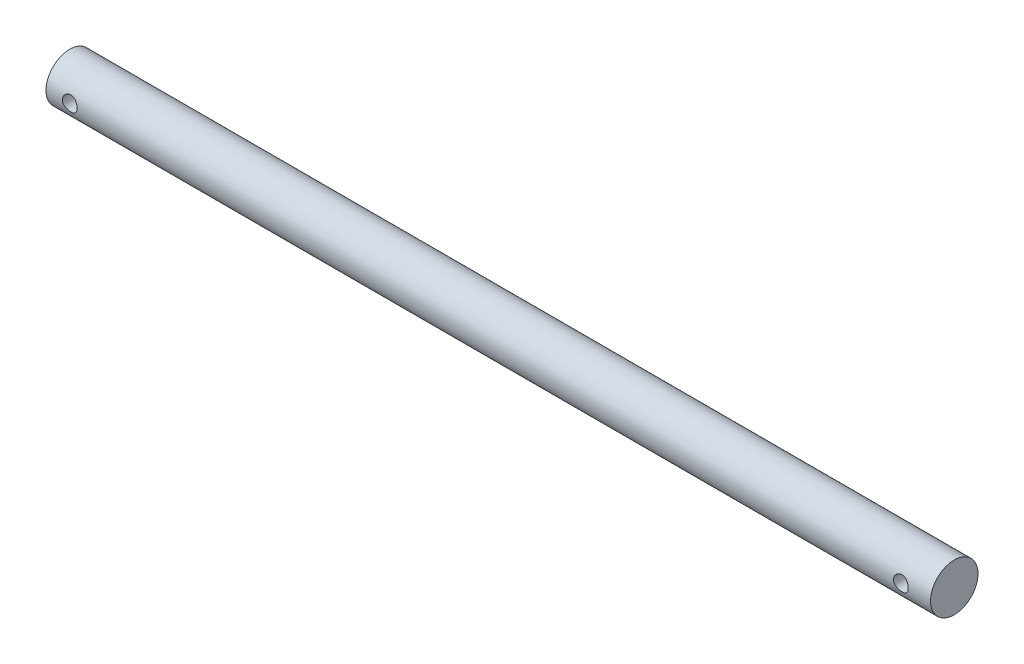
ISO-10303-21;
HEADER;
FILE_DESCRIPTION(('STEP AP214'),'2;1');
FILE_NAME('part.step','',(''),(''),'','','');
FILE_SCHEMA(('AUTOMOTIVE_DESIGN { 1 0 10303 214 1 1 1 1 }'));
ENDSEC;
DATA;
#1=APPLICATION_CONTEXT('core data for automotive mechanical design processes');
#2=APPLICATION_PROTOCOL_DEFINITION('international standard','automotive_design',2000,#1);
#3=PRODUCT_CONTEXT('',#1,'mechanical');
#4=PRODUCT('Part','Part','',(#3));
#5=PRODUCT_RELATED_PRODUCT_CATEGORY('part','',(#4));
#6=PRODUCT_DEFINITION_FORMATION('','',#4);
#7=PRODUCT_DEFINITION_CONTEXT('part definition',#1,'design');
#8=PRODUCT_DEFINITION('design','',#6,#7);
#9=PRODUCT_DEFINITION_SHAPE('','',#8);
#10=(LENGTH_UNIT() NAMED_UNIT(*) SI_UNIT(.MILLI.,.METRE.));
#11=(NAMED_UNIT(*) PLANE_ANGLE_UNIT() SI_UNIT($,.RADIAN.));
#12=(NAMED_UNIT(*) SI_UNIT($,.STERADIAN.) SOLID_ANGLE_UNIT());
#13=UNCERTAINTY_MEASURE_WITH_UNIT(LENGTH_MEASURE(1.E-05),#10,'distance_accuracy_value','');
#14=(GEOMETRIC_REPRESENTATION_CONTEXT(3) GLOBAL_UNCERTAINTY_ASSIGNED_CONTEXT((#13)) GLOBAL_UNIT_ASSIGNED_CONTEXT((#10,
#11,#12)) REPRESENTATION_CONTEXT('',''));
#15=CARTESIAN_POINT('',(0.,0.,0.));
#16=DIRECTION('',(0.,0.,1.));
#17=DIRECTION('',(1.,0.,0.));
#18=AXIS2_PLACEMENT_3D('',#15,#16,#17);
#19=CARTESIAN_POINT('',(74.5,0.,0.));
#20=DIRECTION('',(-1.,0.,0.));
#21=DIRECTION('',(0.,0.,1.));
#22=AXIS2_PLACEMENT_3D('',#19,#20,#21);
#23=CYLINDRICAL_SURFACE('',#22,4.);
#24=CARTESIAN_POINT('',(-69.25,0.,-4.));
#25=CARTESIAN_POINT('',(-69.2500004465876,0.0684391851745459,-3.99999965877989));
#26=CARTESIAN_POINT('',(-69.2556392269445,0.136883052502858,-3.99822694984841));
#27=CARTESIAN_POINT('',(-69.2779862415392,0.271769209588448,-3.99132894088807));
#28=CARTESIAN_POINT('',(-69.2946969813644,0.338211042725907,-3.9862028819986));
#29=CARTESIAN_POINT('',(-69.3385693711957,0.467128543650805,-3.97315815697909));
#30=CARTESIAN_POINT('',(-69.365714844653,0.5296101769858,-3.96524381499025));
#31=CARTESIAN_POINT('',(-69.4296173176783,0.649134802346455,-3.94743969161093));
#32=CARTESIAN_POINT('',(-69.4663758317806,0.706176935444883,-3.93754959899905));
#33=CARTESIAN_POINT('',(-69.5496559920173,0.814965334952278,-3.91650213740283));
#34=CARTESIAN_POINT('',(-69.5964208850611,0.866520028156655,-3.90531715926989));
#35=CARTESIAN_POINT('',(-69.6978683924135,0.961197382036987,-3.88310046374209));
#36=CARTESIAN_POINT('',(-69.7525524774945,1.00431847289869,-3.87206877523457));
#37=CARTESIAN_POINT('',(-69.8699445638081,1.08194336483113,-3.85111144698172));
#38=CARTESIAN_POINT('',(-69.9328174775272,1.11620784150128,-3.84121988301796));
#39=CARTESIAN_POINT('',(-70.0637923149819,1.17359741076671,-3.82407801799235));
#40=CARTESIAN_POINT('',(-70.1318928557939,1.19672543771944,-3.81682702128689));
#41=CARTESIAN_POINT('',(-70.2692280774521,1.23048459930033,-3.80607606984501));
#42=CARTESIAN_POINT('',(-70.3383668436388,1.24147110007864,-3.80246972929508));
#43=CARTESIAN_POINT('',(-70.4775931189119,1.25174555036988,-3.79910055140951));
#44=CARTESIAN_POINT('',(-70.5476803708217,1.25103660995771,-3.79933669227334));
#45=CARTESIAN_POINT('',(-70.683874460269,1.23821824732739,-3.80353189075438));
#46=CARTESIAN_POINT('',(-70.7500291258616,1.22656057869382,-3.80734341745949));
#47=CARTESIAN_POINT('',(-70.8793921565373,1.19290813355625,-3.81802025652489));
#48=CARTESIAN_POINT('',(-70.9426002077088,1.1709122584455,-3.82488589343115));
#49=CARTESIAN_POINT('',(-71.0653519444326,1.11688874681276,-3.84101044014297));
#50=CARTESIAN_POINT('',(-71.124828610692,1.0847192566208,-3.85030284660825));
#51=CARTESIAN_POINT('',(-71.2376877678791,1.01136020737847,-3.8702185658007));
#52=CARTESIAN_POINT('',(-71.2910686702537,0.970168305215762,-3.88084222394551));
#53=CARTESIAN_POINT('',(-71.392774943417,0.877716954182115,-3.90281527800493));
#54=CARTESIAN_POINT('',(-71.4407595577797,0.826084570592807,-3.91417569605696));
#55=CARTESIAN_POINT('',(-71.5274718935797,0.715364408095522,-3.9359157075958));
#56=CARTESIAN_POINT('',(-71.5661989292192,0.656276077349015,-3.94629522838372));
#57=CARTESIAN_POINT('',(-71.6335276886013,0.531664610465452,-3.96501294890191));
#58=CARTESIAN_POINT('',(-71.6620481354639,0.466094906919277,-3.97333460648208));
#59=CARTESIAN_POINT('',(-71.7075530008515,0.330767977782642,-3.98687955828554));
#60=CARTESIAN_POINT('',(-71.7245409222384,0.261012030724604,-3.99210379325151));
#61=CARTESIAN_POINT('',(-71.745918042579,0.12218515729034,-3.99871389395014));
#62=CARTESIAN_POINT('',(-71.7507685435935,0.0531918487888381,-4.00024022895439));
#63=CARTESIAN_POINT('',(-71.7490337733627,-0.0846303057325872,-3.99969799730981));
#64=CARTESIAN_POINT('',(-71.7424501726774,-0.153459174306507,-3.99762995581125));
#65=CARTESIAN_POINT('',(-71.7184044073936,-0.287219332975851,-3.99022363769772));
#66=CARTESIAN_POINT('',(-71.7012167323875,-0.352204978420946,-3.98496793110725));
#67=CARTESIAN_POINT('',(-71.6567856476333,-0.478351928861363,-3.97180121379252));
#68=CARTESIAN_POINT('',(-71.6295409959751,-0.539512760449014,-3.96388987514204));
#69=CARTESIAN_POINT('',(-71.5650267834512,-0.657932406672231,-3.94598542759568));
#70=CARTESIAN_POINT('',(-71.5275290125028,-0.715059739787955,-3.9359462681821));
#71=CARTESIAN_POINT('',(-71.443846789883,-0.822365850960095,-3.91493410002887));
#72=CARTESIAN_POINT('',(-71.3976599822569,-0.872542738043335,-3.90396083845862));
#73=CARTESIAN_POINT('',(-71.2957411099463,-0.966587462919652,-3.88176994885247));
#74=CARTESIAN_POINT('',(-71.2397033362547,-1.01012652339773,-3.87055986714446));
#75=CARTESIAN_POINT('',(-71.1208733836293,-1.08721250244908,-3.84961947087602));
#76=CARTESIAN_POINT('',(-71.0580813119956,-1.12075957972523,-3.839889132814));
#77=CARTESIAN_POINT('',(-70.9276548271141,-1.1767008348114,-3.82311782360754));
#78=CARTESIAN_POINT('',(-70.8600403504953,-1.19913819558885,-3.81606646468027));
#79=CARTESIAN_POINT('',(-70.7217275066762,-1.23222894320963,-3.80551170941212));
#80=CARTESIAN_POINT('',(-70.6510303236287,-1.24288681414609,-3.80200696302675));
#81=CARTESIAN_POINT('',(-70.5119959124457,-1.2517940615754,-3.79908292712495));
#82=CARTESIAN_POINT('',(-70.4436965461871,-1.25058279621957,-3.79948604683077));
#83=CARTESIAN_POINT('',(-70.3083254150808,-1.23708818129473,-3.80390090472383));
#84=CARTESIAN_POINT('',(-70.241253593116,-1.22480534822559,-3.80791247457319));
#85=CARTESIAN_POINT('',(-70.1112059603982,-1.18987729913377,-3.81896814158112));
#86=CARTESIAN_POINT('',(-70.048184558904,-1.16738642405944,-3.82596698183474));
#87=CARTESIAN_POINT('',(-69.9267595864687,-1.11280227335063,-3.84219704261348));
#88=CARTESIAN_POINT('',(-69.8683569579223,-1.08070704444254,-3.85142871716522));
#89=CARTESIAN_POINT('',(-69.7553540295594,-1.00635675013475,-3.8715348703158));
#90=CARTESIAN_POINT('',(-69.7009918704995,-0.963753335241267,-3.88245948922441));
#91=CARTESIAN_POINT('',(-69.6000136718882,-0.870208996404838,-3.90448998821726));
#92=CARTESIAN_POINT('',(-69.553399711009,-0.819265842344392,-3.91559591606795));
#93=CARTESIAN_POINT('',(-69.467717461637,-0.708486662823322,-3.93717271952329));
#94=CARTESIAN_POINT('',(-69.42894526355,-0.648414574487371,-3.94761101730634));
#95=CARTESIAN_POINT('',(-69.3621010848606,-0.522279138013646,-3.96626769296917));
#96=CARTESIAN_POINT('',(-69.3340248978582,-0.45621815779544,-3.97448694315832));
#97=CARTESIAN_POINT('',(-69.2914086323915,-0.325747635373969,-3.98720650733461));
#98=CARTESIAN_POINT('',(-69.2759251326947,-0.26167033711254,-3.99196240806139));
#99=CARTESIAN_POINT('',(-69.2552216400323,-0.131729895440245,-3.99835900340486));
#100=CARTESIAN_POINT('',(-69.249999570196,-0.0658671161396737,-4.00000032839644));
#101=CARTESIAN_POINT('',(-69.25,0.,-4.));
#102=B_SPLINE_CURVE_WITH_KNOTS('',3,(#24,#25,#26,#27,#28,#29,#30,#31,#32,#33,#34,#35,#36,#37,
#38,#39,#40,#41,#42,#43,#44,#45,#46,#47,#48,#49,#50,#51,#52,#53,#54,#55,#56,#57,#58,#59,#60,#61,
#62,#63,#64,#65,#66,#67,#68,#69,#70,#71,#72,#73,#74,#75,#76,#77,#78,#79,#80,#81,#82,#83,#84,#85,
#86,#87,#88,#89,#90,#91,#92,#93,#94,#95,#96,#97,#98,#99,#100,#101),.UNSPECIFIED.,.T.,.F.,(4,2,2,
2,2,2,2,2,2,2,2,2,2,2,2,2,2,2,2,2,2,2,2,2,2,2,2,2,2,2,2,2,2,2,2,2,2,2,4),(0.,0.205075449432509,
0.410197323349064,0.615002479202435,0.819839921558386,1.03037822195157,1.24095567431276,
1.45673771247492,1.67246286279527,1.88169150167208,2.09086450295138,2.2917691742217,
2.49269519979063,2.69655642720545,2.90047066010358,3.113667472796,3.32688007413302,
3.54175460689768,3.75656384494553,3.96307568548236,4.16955735649361,4.3709062672287,
4.57228005034498,4.77856324738341,4.98490245709257,5.19941778713137,5.4139297098371,
5.62760115751029,5.8411912389243,6.04512203476053,6.24904331751082,6.44997913396668,
6.6509558433017,6.8597951400636,7.06869037373339,7.2844066812641,7.50003806666335,
7.69744636651538,7.89481470763045),.UNSPECIFIED.);
#103=CARTESIAN_POINT('',(-69.25,0.,-4.));
#104=VERTEX_POINT('',#103);
#105=EDGE_CURVE('E10',#104,#104,#102,.T.);
#106=ORIENTED_EDGE('',*,*,#105,.T.);
#107=EDGE_LOOP('',(#106));
#108=FACE_BOUND('',#107,.T.);
#109=CARTESIAN_POINT('',(-69.25,0.,4.));
#110=CARTESIAN_POINT('',(-69.2500004465876,-0.0684391851745463,3.99999965877989));
#111=CARTESIAN_POINT('',(-69.2556392269445,-0.136883052502859,3.99822694984841));
#112=CARTESIAN_POINT('',(-69.2779862415392,-0.271769209588448,3.99132894088807));
#113=CARTESIAN_POINT('',(-69.2946969813644,-0.338211042725908,3.9862028819986));
#114=CARTESIAN_POINT('',(-69.3385693711957,-0.467128543650805,3.97315815697909));
#115=CARTESIAN_POINT('',(-69.365714844653,-0.5296101769858,3.96524381499025));
#116=CARTESIAN_POINT('',(-69.4296173176783,-0.649134802346456,3.94743969161093));
#117=CARTESIAN_POINT('',(-69.4663758317806,-0.706176935444884,3.93754959899905));
#118=CARTESIAN_POINT('',(-69.5496559920173,-0.814965334952277,3.91650213740283));
#119=CARTESIAN_POINT('',(-69.5964208850611,-0.86652002815665,3.90531715926989));
#120=CARTESIAN_POINT('',(-69.6978683924135,-0.961197382036982,3.88310046374209));
#121=CARTESIAN_POINT('',(-69.7525524774945,-1.00431847289869,3.87206877523457));
#122=CARTESIAN_POINT('',(-69.8699445638081,-1.08194336483113,3.85111144698172));
#123=CARTESIAN_POINT('',(-69.9328174775272,-1.11620784150128,3.84121988301796));
#124=CARTESIAN_POINT('',(-70.0637923149819,-1.17359741076671,3.82407801799234));
#125=CARTESIAN_POINT('',(-70.1318928557939,-1.19672543771944,3.81682702128689));
#126=CARTESIAN_POINT('',(-70.2692280774521,-1.23048459930033,3.80607606984501));
#127=CARTESIAN_POINT('',(-70.3383668436388,-1.24147110007864,3.80246972929508));
#128=CARTESIAN_POINT('',(-70.4775931189119,-1.25174555036988,3.79910055140951));
#129=CARTESIAN_POINT('',(-70.5476803708217,-1.25103660995772,3.79933669227334));
#130=CARTESIAN_POINT('',(-70.683874460269,-1.23821824732739,3.80353189075438));
#131=CARTESIAN_POINT('',(-70.7500291258616,-1.22656057869382,3.80734341745949));
#132=CARTESIAN_POINT('',(-70.8793921565373,-1.19290813355625,3.81802025652489));
#133=CARTESIAN_POINT('',(-70.9426002077088,-1.1709122584455,3.82488589343115));
#134=CARTESIAN_POINT('',(-71.0653519444326,-1.11688874681276,3.84101044014297));
#135=CARTESIAN_POINT('',(-71.124828610692,-1.08471925662081,3.85030284660825));
#136=CARTESIAN_POINT('',(-71.2376877678791,-1.01136020737847,3.8702185658007));
#137=CARTESIAN_POINT('',(-71.2910686702537,-0.970168305215763,3.88084222394551));
#138=CARTESIAN_POINT('',(-71.392774943417,-0.877716954182116,3.90281527800493));
#139=CARTESIAN_POINT('',(-71.4407595577797,-0.826084570592808,3.91417569605696));
#140=CARTESIAN_POINT('',(-71.5274718935797,-0.715364408095523,3.9359157075958));
#141=CARTESIAN_POINT('',(-71.5661989292192,-0.656276077349016,3.94629522838372));
#142=CARTESIAN_POINT('',(-71.6335276886013,-0.53166461046545,3.96501294890191));
#143=CARTESIAN_POINT('',(-71.6620481354639,-0.466094906919273,3.97333460648208));
#144=CARTESIAN_POINT('',(-71.7075530008515,-0.330767977782637,3.98687955828554));
#145=CARTESIAN_POINT('',(-71.7245409222384,-0.261012030724603,3.99210379325151));
#146=CARTESIAN_POINT('',(-71.745918042579,-0.122185157290341,3.99871389395014));
#147=CARTESIAN_POINT('',(-71.7507685435935,-0.0531918487888389,4.00024022895439));
#148=CARTESIAN_POINT('',(-71.7490337733627,0.0846303057325866,3.99969799730981));
#149=CARTESIAN_POINT('',(-71.7424501726774,0.153459174306506,3.99762995581125));
#150=CARTESIAN_POINT('',(-71.7184044073936,0.287219332975853,3.99022363769772));
#151=CARTESIAN_POINT('',(-71.7012167323875,0.352204978420952,3.98496793110725));
#152=CARTESIAN_POINT('',(-71.6567856476333,0.478351928861368,3.97180121379252));
#153=CARTESIAN_POINT('',(-71.6295409959751,0.539512760449014,3.96388987514204));
#154=CARTESIAN_POINT('',(-71.5650267834512,0.657932406672227,3.94598542759568));
#155=CARTESIAN_POINT('',(-71.5275290125028,0.715059739787953,3.9359462681821));
#156=CARTESIAN_POINT('',(-71.443846789883,0.822365850960094,3.91493410002887));
#157=CARTESIAN_POINT('',(-71.3976599822569,0.872542738043333,3.90396083845862));
#158=CARTESIAN_POINT('',(-71.2957411099463,0.966587462919651,3.88176994885248));
#159=CARTESIAN_POINT('',(-71.2397033362547,1.01012652339773,3.87055986714446));
#160=CARTESIAN_POINT('',(-71.1208733836293,1.08721250244908,3.84961947087602));
#161=CARTESIAN_POINT('',(-71.0580813119956,1.12075957972523,3.839889132814));
#162=CARTESIAN_POINT('',(-70.9276548271141,1.1767008348114,3.82311782360754));
#163=CARTESIAN_POINT('',(-70.8600403504953,1.19913819558885,3.81606646468027));
#164=CARTESIAN_POINT('',(-70.7217275066762,1.23222894320963,3.80551170941212));
#165=CARTESIAN_POINT('',(-70.6510303236287,1.24288681414609,3.80200696302675));
#166=CARTESIAN_POINT('',(-70.5119959124457,1.2517940615754,3.79908292712495));
#167=CARTESIAN_POINT('',(-70.4436965461871,1.25058279621956,3.79948604683077));
#168=CARTESIAN_POINT('',(-70.3083254150808,1.23708818129473,3.80390090472383));
#169=CARTESIAN_POINT('',(-70.241253593116,1.22480534822559,3.80791247457319));
#170=CARTESIAN_POINT('',(-70.1112059603982,1.18987729913377,3.81896814158112));
#171=CARTESIAN_POINT('',(-70.048184558904,1.16738642405943,3.82596698183474));
#172=CARTESIAN_POINT('',(-69.9267595864687,1.11280227335063,3.84219704261348));
#173=CARTESIAN_POINT('',(-69.8683569579223,1.08070704444254,3.85142871716522));
#174=CARTESIAN_POINT('',(-69.7553540295594,1.00635675013474,3.8715348703158));
#175=CARTESIAN_POINT('',(-69.7009918704995,0.963753335241266,3.88245948922441));
#176=CARTESIAN_POINT('',(-69.6000136718882,0.870208996404837,3.90448998821726));
#177=CARTESIAN_POINT('',(-69.553399711009,0.819265842344391,3.91559591606795));
#178=CARTESIAN_POINT('',(-69.467717461637,0.708486662823321,3.93717271952329));
#179=CARTESIAN_POINT('',(-69.42894526355,0.64841457448737,3.94761101730634));
#180=CARTESIAN_POINT('',(-69.3621010848606,0.522279138013645,3.96626769296917));
#181=CARTESIAN_POINT('',(-69.3340248978582,0.45621815779544,3.97448694315832));
#182=CARTESIAN_POINT('',(-69.2914086323915,0.325747635373969,3.98720650733461));
#183=CARTESIAN_POINT('',(-69.2759251326947,0.261670337112539,3.99196240806139));
#184=CARTESIAN_POINT('',(-69.2552216400323,0.131729895440244,3.99835900340486));
#185=CARTESIAN_POINT('',(-69.249999570196,0.065867116139673,4.00000032839644));
#186=CARTESIAN_POINT('',(-69.25,0.,4.));
#187=B_SPLINE_CURVE_WITH_KNOTS('',3,(#109,#110,#111,#112,#113,#114,#115,#116,#117,#118,#119,
#120,#121,#122,#123,#124,#125,#126,#127,#128,#129,#130,#131,#132,#133,#134,#135,#136,#137,#138,
#139,#140,#141,#142,#143,#144,#145,#146,#147,#148,#149,#150,#151,#152,#153,#154,#155,#156,#157,
#158,#159,#160,#161,#162,#163,#164,#165,#166,#167,#168,#169,#170,#171,#172,#173,#174,#175,#176,
#177,#178,#179,#180,#181,#182,#183,#184,#185,#186),.UNSPECIFIED.,.T.,.F.,(4,2,2,2,2,2,2,2,2,2,2,
2,2,2,2,2,2,2,2,2,2,2,2,2,2,2,2,2,2,2,2,2,2,2,2,2,2,2,4),(0.,0.205075449432509,
0.410197323349064,0.615002479202435,0.819839921558386,1.03037822195157,1.24095567431276,
1.45673771247492,1.67246286279527,1.88169150167208,2.09086450295138,2.2917691742217,
2.49269519979063,2.69655642720545,2.90047066010358,3.113667472796,3.32688007413302,
3.54175460689769,3.75656384494552,3.96307568548236,4.16955735649361,4.37090626722871,
4.57228005034498,4.77856324738341,4.98490245709257,5.19941778713137,5.41392970983709,
5.62760115751029,5.8411912389243,6.04512203476052,6.24904331751082,6.44997913396667,
6.6509558433017,6.8597951400636,7.06869037373339,7.2844066812641,7.50003806666335,
7.69744636651538,7.89481470763044),.UNSPECIFIED.);
#188=CARTESIAN_POINT('',(-69.25,0.,4.));
#189=VERTEX_POINT('',#188);
#190=EDGE_CURVE('E42',#189,#189,#187,.T.);
#191=ORIENTED_EDGE('',*,*,#190,.T.);
#192=EDGE_LOOP('',(#191));
#193=FACE_BOUND('',#192,.T.);
#194=CARTESIAN_POINT('',(70.75,0.,-4.));
#195=CARTESIAN_POINT('',(70.7499995534124,0.0684391851745458,-3.99999965877989));
#196=CARTESIAN_POINT('',(70.7443607730555,0.136883052502858,-3.99822694984841));
#197=CARTESIAN_POINT('',(70.7220137584607,0.271769209588447,-3.99132894088807));
#198=CARTESIAN_POINT('',(70.7053030186356,0.338211042725907,-3.9862028819986));
#199=CARTESIAN_POINT('',(70.6614306288043,0.467128543650805,-3.97315815697909));
#200=CARTESIAN_POINT('',(70.634285155347,0.529610176985799,-3.96524381499025));
#201=CARTESIAN_POINT('',(70.5703826823217,0.649134802346455,-3.94743969161093));
#202=CARTESIAN_POINT('',(70.5336241682194,0.706176935444882,-3.93754959899905));
#203=CARTESIAN_POINT('',(70.4503440079826,0.814965334952278,-3.91650213740283));
#204=CARTESIAN_POINT('',(70.4035791149389,0.866520028156655,-3.90531715926989));
#205=CARTESIAN_POINT('',(70.3021316075864,0.961197382036987,-3.88310046374209));
#206=CARTESIAN_POINT('',(70.2474475225054,1.00431847289869,-3.87206877523457));
#207=CARTESIAN_POINT('',(70.1300554361919,1.08194336483113,-3.85111144698172));
#208=CARTESIAN_POINT('',(70.0671825224727,1.11620784150129,-3.84121988301796));
#209=CARTESIAN_POINT('',(69.9362076850181,1.17359741076672,-3.82407801799234));
#210=CARTESIAN_POINT('',(69.868107144206,1.19672543771944,-3.81682702128689));
#211=CARTESIAN_POINT('',(69.7307719225479,1.23048459930033,-3.80607606984501));
#212=CARTESIAN_POINT('',(69.6616331563611,1.24147110007864,-3.80246972929508));
#213=CARTESIAN_POINT('',(69.5224068810881,1.25174555036988,-3.79910055140951));
#214=CARTESIAN_POINT('',(69.4523196291783,1.25103660995771,-3.79933669227334));
#215=CARTESIAN_POINT('',(69.316125539731,1.23821824732739,-3.80353189075438));
#216=CARTESIAN_POINT('',(69.2499708741384,1.22656057869382,-3.80734341745949));
#217=CARTESIAN_POINT('',(69.1206078434626,1.19290813355625,-3.81802025652489));
#218=CARTESIAN_POINT('',(69.0573997922912,1.17091225844549,-3.82488589343115));
#219=CARTESIAN_POINT('',(68.9346480555673,1.11688874681276,-3.84101044014297));
#220=CARTESIAN_POINT('',(68.875171389308,1.08471925662081,-3.85030284660825));
#221=CARTESIAN_POINT('',(68.7623122321209,1.01136020737847,-3.8702185658007));
#222=CARTESIAN_POINT('',(68.7089313297463,0.970168305215764,-3.88084222394551));
#223=CARTESIAN_POINT('',(68.607225056583,0.877716954182114,-3.90281527800493));
#224=CARTESIAN_POINT('',(68.5592404422203,0.826084570592807,-3.91417569605696));
#225=CARTESIAN_POINT('',(68.4725281064203,0.715364408095522,-3.9359157075958));
#226=CARTESIAN_POINT('',(68.4338010707808,0.656276077349015,-3.94629522838372));
#227=CARTESIAN_POINT('',(68.3664723113987,0.53166461046545,-3.96501294890191));
#228=CARTESIAN_POINT('',(68.337951864536,0.466094906919274,-3.97333460648208));
#229=CARTESIAN_POINT('',(68.2924469991484,0.330767977782638,-3.98687955828554));
#230=CARTESIAN_POINT('',(68.2754590777616,0.261012030724603,-3.99210379325151));
#231=CARTESIAN_POINT('',(68.254081957421,0.12218515729034,-3.99871389395014));
#232=CARTESIAN_POINT('',(68.2492314564065,0.0531918487888385,-4.00024022895439));
#233=CARTESIAN_POINT('',(68.2509662266373,-0.0846303057325867,-3.99969799730981));
#234=CARTESIAN_POINT('',(68.2575498273226,-0.153459174306507,-3.99762995581125));
#235=CARTESIAN_POINT('',(68.2815955926064,-0.287219332975854,-3.99022363769772));
#236=CARTESIAN_POINT('',(68.2987832676125,-0.352204978420953,-3.98496793110725));
#237=CARTESIAN_POINT('',(68.3432143523667,-0.478351928861369,-3.97180121379252));
#238=CARTESIAN_POINT('',(68.3704590040249,-0.539512760449017,-3.96388987514203));
#239=CARTESIAN_POINT('',(68.4349732165488,-0.657932406672231,-3.94598542759568));
#240=CARTESIAN_POINT('',(68.4724709874972,-0.715059739787956,-3.9359462681821));
#241=CARTESIAN_POINT('',(68.556153210117,-0.822365850960096,-3.91493410002887));
#242=CARTESIAN_POINT('',(68.6023400177431,-0.872542738043335,-3.90396083845862));
#243=CARTESIAN_POINT('',(68.7042588900537,-0.966587462919653,-3.88176994885247));
#244=CARTESIAN_POINT('',(68.7602966637453,-1.01012652339773,-3.87055986714446));
#245=CARTESIAN_POINT('',(68.8791266163707,-1.08721250244908,-3.84961947087602));
#246=CARTESIAN_POINT('',(68.9419186880044,-1.12075957972523,-3.839889132814));
#247=CARTESIAN_POINT('',(69.0723451728858,-1.1767008348114,-3.82311782360754));
#248=CARTESIAN_POINT('',(69.1399596495047,-1.19913819558885,-3.81606646468027));
#249=CARTESIAN_POINT('',(69.2782724933238,-1.23222894320963,-3.80551170941212));
#250=CARTESIAN_POINT('',(69.3489696763713,-1.2428868141461,-3.80200696302675));
#251=CARTESIAN_POINT('',(69.4880040875542,-1.2517940615754,-3.79908292712494));
#252=CARTESIAN_POINT('',(69.5563034538129,-1.25058279621957,-3.79948604683077));
#253=CARTESIAN_POINT('',(69.6916745849192,-1.23708818129473,-3.80390090472383));
#254=CARTESIAN_POINT('',(69.758746406884,-1.22480534822559,-3.80791247457319));
#255=CARTESIAN_POINT('',(69.8887940396018,-1.18987729913378,-3.81896814158112));
#256=CARTESIAN_POINT('',(69.951815441096,-1.16738642405944,-3.82596698183474));
#257=CARTESIAN_POINT('',(70.0732404135313,-1.11280227335063,-3.84219704261348));
#258=CARTESIAN_POINT('',(70.1316430420777,-1.08070704444254,-3.85142871716522));
#259=CARTESIAN_POINT('',(70.2446459704406,-1.00635675013475,-3.8715348703158));
#260=CARTESIAN_POINT('',(70.2990081295004,-0.963753335241267,-3.88245948922441));
#261=CARTESIAN_POINT('',(70.3999863281118,-0.870208996404839,-3.90448998821726));
#262=CARTESIAN_POINT('',(70.446600288991,-0.819265842344392,-3.91559591606795));
#263=CARTESIAN_POINT('',(70.532282538363,-0.708486662823322,-3.93717271952329));
#264=CARTESIAN_POINT('',(70.57105473645,-0.648414574487371,-3.94761101730634));
#265=CARTESIAN_POINT('',(70.6378989151394,-0.522279138013646,-3.96626769296917));
#266=CARTESIAN_POINT('',(70.6659751021418,-0.45621815779544,-3.97448694315832));
#267=CARTESIAN_POINT('',(70.7085913676085,-0.32574763537397,-3.98720650733461));
#268=CARTESIAN_POINT('',(70.7240748673053,-0.26167033711254,-3.99196240806139));
#269=CARTESIAN_POINT('',(70.7447783599677,-0.131729895440245,-3.99835900340486));
#270=CARTESIAN_POINT('',(70.750000429804,-0.0658671161396736,-4.00000032839644));
#271=CARTESIAN_POINT('',(70.75,0.,-4.));
#272=B_SPLINE_CURVE_WITH_KNOTS('',3,(#194,#195,#196,#197,#198,#199,#200,#201,#202,#203,#204,
#205,#206,#207,#208,#209,#210,#211,#212,#213,#214,#215,#216,#217,#218,#219,#220,#221,#222,#223,
#224,#225,#226,#227,#228,#229,#230,#231,#232,#233,#234,#235,#236,#237,#238,#239,#240,#241,#242,
#243,#244,#245,#246,#247,#248,#249,#250,#251,#252,#253,#254,#255,#256,#257,#258,#259,#260,#261,
#262,#263,#264,#265,#266,#267,#268,#269,#270,#271),.UNSPECIFIED.,.T.,.F.,(4,2,2,2,2,2,2,2,2,2,2,
2,2,2,2,2,2,2,2,2,2,2,2,2,2,2,2,2,2,2,2,2,2,2,2,2,2,2,4),(0.,0.205075449432509,
0.410197323349064,0.615002479202435,0.819839921558386,1.03037822195157,1.24095567431276,
1.45673771247496,1.67246286279527,1.88169150167211,2.09086450295138,2.2917691742217,
2.49269519979063,2.69655642720545,2.90047066010358,3.113667472796,3.32688007413302,
3.54175460689769,3.75656384494553,3.96307568548236,4.16955735649361,4.37090626722871,
4.57228005034498,4.77856324738341,4.98490245709257,5.19941778713137,5.4139297098371,
5.62760115751029,5.8411912389243,6.04512203476053,6.24904331751082,6.44997913396668,
6.6509558433017,6.8597951400636,7.06869037373339,7.2844066812641,7.50003806666335,
7.69744636651538,7.89481470763044),.UNSPECIFIED.);
#273=CARTESIAN_POINT('',(70.75,0.,-4.));
#274=VERTEX_POINT('',#273);
#275=EDGE_CURVE('E46',#274,#274,#272,.T.);
#276=ORIENTED_EDGE('',*,*,#275,.T.);
#277=EDGE_LOOP('',(#276));
#278=FACE_BOUND('',#277,.T.);
#279=CARTESIAN_POINT('',(70.75,0.,4.));
#280=CARTESIAN_POINT('',(70.7499995534124,-0.0684391851745464,3.99999965877989));
#281=CARTESIAN_POINT('',(70.7443607730555,-0.136883052502859,3.99822694984841));
#282=CARTESIAN_POINT('',(70.7220137584607,-0.271769209588448,3.99132894088807));
#283=CARTESIAN_POINT('',(70.7053030186356,-0.338211042725908,3.9862028819986));
#284=CARTESIAN_POINT('',(70.6614306288043,-0.467128543650805,3.97315815697909));
#285=CARTESIAN_POINT('',(70.634285155347,-0.5296101769858,3.96524381499025));
#286=CARTESIAN_POINT('',(70.5703826823217,-0.649134802346456,3.94743969161093));
#287=CARTESIAN_POINT('',(70.5336241682194,-0.706176935444883,3.93754959899905));
#288=CARTESIAN_POINT('',(70.4503440079826,-0.814965334952279,3.91650213740283));
#289=CARTESIAN_POINT('',(70.4035791149389,-0.866520028156656,3.90531715926989));
#290=CARTESIAN_POINT('',(70.3021316075864,-0.961197382036988,3.88310046374209));
#291=CARTESIAN_POINT('',(70.2474475225054,-1.00431847289869,3.87206877523457));
#292=CARTESIAN_POINT('',(70.1300554361919,-1.08194336483113,3.85111144698172));
#293=CARTESIAN_POINT('',(70.0671825224728,-1.11620784150128,3.84121988301796));
#294=CARTESIAN_POINT('',(69.9362076850181,-1.17359741076671,3.82407801799234));
#295=CARTESIAN_POINT('',(69.868107144206,-1.19672543771944,3.81682702128689));
#296=CARTESIAN_POINT('',(69.7307719225479,-1.23048459930033,3.80607606984501));
#297=CARTESIAN_POINT('',(69.6616331563611,-1.24147110007864,3.80246972929508));
#298=CARTESIAN_POINT('',(69.5224068810881,-1.25174555036988,3.7991005514095));
#299=CARTESIAN_POINT('',(69.4523196291783,-1.25103660995771,3.79933669227334));
#300=CARTESIAN_POINT('',(69.316125539731,-1.23821824732739,3.80353189075438));
#301=CARTESIAN_POINT('',(69.2499708741384,-1.22656057869382,3.80734341745949));
#302=CARTESIAN_POINT('',(69.1206078434626,-1.19290813355625,3.81802025652489));
#303=CARTESIAN_POINT('',(69.0573997922912,-1.1709122584455,3.82488589343115));
#304=CARTESIAN_POINT('',(68.9346480555673,-1.11688874681276,3.84101044014297));
#305=CARTESIAN_POINT('',(68.875171389308,-1.08471925662081,3.85030284660825));
#306=CARTESIAN_POINT('',(68.7623122321209,-1.01136020737848,3.8702185658007));
#307=CARTESIAN_POINT('',(68.7089313297463,-0.970168305215765,3.88084222394551));
#308=CARTESIAN_POINT('',(68.607225056583,-0.877716954182115,3.90281527800493));
#309=CARTESIAN_POINT('',(68.5592404422203,-0.826084570592808,3.91417569605696));
#310=CARTESIAN_POINT('',(68.4725281064203,-0.715364408095523,3.9359157075958));
#311=CARTESIAN_POINT('',(68.4338010707808,-0.656276077349016,3.94629522838372));
#312=CARTESIAN_POINT('',(68.3664723113987,-0.531664610465452,3.96501294890191));
#313=CARTESIAN_POINT('',(68.337951864536,-0.466094906919276,3.97333460648208));
#314=CARTESIAN_POINT('',(68.2924469991484,-0.33076797778264,3.98687955828554));
#315=CARTESIAN_POINT('',(68.2754590777616,-0.261012030724605,3.99210379325151));
#316=CARTESIAN_POINT('',(68.254081957421,-0.122185157290342,3.99871389395014));
#317=CARTESIAN_POINT('',(68.2492314564065,-0.0531918487888393,4.00024022895439));
#318=CARTESIAN_POINT('',(68.2509662266373,0.0846303057325861,3.99969799730981));
#319=CARTESIAN_POINT('',(68.2575498273226,0.153459174306505,3.99762995581125));
#320=CARTESIAN_POINT('',(68.2815955926064,0.287219332975851,3.99022363769772));
#321=CARTESIAN_POINT('',(68.2987832676125,0.352204978420949,3.98496793110725));
#322=CARTESIAN_POINT('',(68.3432143523667,0.478351928861364,3.97180121379252));
#323=CARTESIAN_POINT('',(68.3704590040249,0.539512760449012,3.96388987514204));
#324=CARTESIAN_POINT('',(68.4349732165488,0.657932406672227,3.94598542759568));
#325=CARTESIAN_POINT('',(68.4724709874972,0.715059739787953,3.9359462681821));
#326=CARTESIAN_POINT('',(68.556153210117,0.822365850960094,3.91493410002887));
#327=CARTESIAN_POINT('',(68.6023400177431,0.872542738043333,3.90396083845862));
#328=CARTESIAN_POINT('',(68.7042588900537,0.966587462919651,3.88176994885248));
#329=CARTESIAN_POINT('',(68.7602966637453,1.01012652339773,3.87055986714446));
#330=CARTESIAN_POINT('',(68.8791266163707,1.08721250244908,3.84961947087602));
#331=CARTESIAN_POINT('',(68.9419186880044,1.12075957972523,3.839889132814));
#332=CARTESIAN_POINT('',(69.0723451728858,1.1767008348114,3.82311782360754));
#333=CARTESIAN_POINT('',(69.1399596495047,1.19913819558885,3.81606646468027));
#334=CARTESIAN_POINT('',(69.2782724933238,1.23222894320963,3.80551170941212));
#335=CARTESIAN_POINT('',(69.3489696763713,1.24288681414609,3.80200696302675));
#336=CARTESIAN_POINT('',(69.4880040875542,1.2517940615754,3.79908292712495));
#337=CARTESIAN_POINT('',(69.5563034538129,1.25058279621956,3.79948604683077));
#338=CARTESIAN_POINT('',(69.6916745849192,1.23708818129473,3.80390090472383));
#339=CARTESIAN_POINT('',(69.758746406884,1.22480534822559,3.80791247457319));
#340=CARTESIAN_POINT('',(69.8887940396018,1.18987729913377,3.81896814158112));
#341=CARTESIAN_POINT('',(69.951815441096,1.16738642405943,3.82596698183474));
#342=CARTESIAN_POINT('',(70.0732404135313,1.11280227335063,3.84219704261348));
#343=CARTESIAN_POINT('',(70.1316430420777,1.08070704444254,3.85142871716522));
#344=CARTESIAN_POINT('',(70.2446459704406,1.00635675013474,3.8715348703158));
#345=CARTESIAN_POINT('',(70.2990081295004,0.963753335241266,3.88245948922441));
#346=CARTESIAN_POINT('',(70.3999863281118,0.870208996404837,3.90448998821726));
#347=CARTESIAN_POINT('',(70.446600288991,0.819265842344391,3.91559591606795));
#348=CARTESIAN_POINT('',(70.532282538363,0.708486662823321,3.93717271952329));
#349=CARTESIAN_POINT('',(70.57105473645,0.64841457448737,3.94761101730634));
#350=CARTESIAN_POINT('',(70.6378989151394,0.522279138013645,3.96626769296917));
#351=CARTESIAN_POINT('',(70.6659751021418,0.45621815779544,3.97448694315832));
#352=CARTESIAN_POINT('',(70.7085913676085,0.325747635373969,3.98720650733461));
#353=CARTESIAN_POINT('',(70.7240748673053,0.26167033711254,3.99196240806139));
#354=CARTESIAN_POINT('',(70.7447783599677,0.131729895440245,3.99835900340486));
#355=CARTESIAN_POINT('',(70.750000429804,0.0658671161396732,4.00000032839644));
#356=CARTESIAN_POINT('',(70.75,0.,4.));
#357=B_SPLINE_CURVE_WITH_KNOTS('',3,(#279,#280,#281,#282,#283,#284,#285,#286,#287,#288,#289,
#290,#291,#292,#293,#294,#295,#296,#297,#298,#299,#300,#301,#302,#303,#304,#305,#306,#307,#308,
#309,#310,#311,#312,#313,#314,#315,#316,#317,#318,#319,#320,#321,#322,#323,#324,#325,#326,#327,
#328,#329,#330,#331,#332,#333,#334,#335,#336,#337,#338,#339,#340,#341,#342,#343,#344,#345,#346,
#347,#348,#349,#350,#351,#352,#353,#354,#355,#356),.UNSPECIFIED.,.T.,.F.,(4,2,2,2,2,2,2,2,2,2,2,
2,2,2,2,2,2,2,2,2,2,2,2,2,2,2,2,2,2,2,2,2,2,2,2,2,2,2,4),(0.,0.205075449432509,
0.410197323349064,0.615002479202435,0.819839921558386,1.03037822195157,1.24095567431276,
1.45673771247494,1.67246286279527,1.88169150167211,2.09086450295138,2.2917691742217,
2.49269519979063,2.69655642720545,2.90047066010358,3.113667472796,3.32688007413302,
3.54175460689769,3.75656384494553,3.96307568548236,4.16955735649361,4.3709062672287,
4.57228005034498,4.77856324738341,4.98490245709257,5.19941778713137,5.41392970983709,
5.62760115751029,5.8411912389243,6.04512203476052,6.24904331751082,6.44997913396667,
6.6509558433017,6.8597951400636,7.06869037373339,7.2844066812641,7.50003806666335,
7.69744636651538,7.89481470763044),.UNSPECIFIED.);
#358=CARTESIAN_POINT('',(70.75,0.,4.));
#359=VERTEX_POINT('',#358);
#360=EDGE_CURVE('E50',#359,#359,#357,.T.);
#361=ORIENTED_EDGE('',*,*,#360,.T.);
#362=EDGE_LOOP('',(#361));
#363=FACE_BOUND('',#362,.T.);
#364=CARTESIAN_POINT('',(74.5,0.,0.));
#365=DIRECTION('',(1.,0.,0.));
#366=DIRECTION('',(0.,0.,-1.));
#367=AXIS2_PLACEMENT_3D('',#364,#365,#366);
#368=CIRCLE('',#367,4.);
#369=CARTESIAN_POINT('',(74.5,0.,-4.));
#370=VERTEX_POINT('',#369);
#371=EDGE_CURVE('E75',#370,#370,#368,.T.);
#372=ORIENTED_EDGE('',*,*,#371,.F.);
#373=EDGE_LOOP('',(#372));
#374=FACE_BOUND('',#373,.T.);
#375=CARTESIAN_POINT('',(-74.5,0.,0.));
#376=DIRECTION('',(1.,0.,0.));
#377=DIRECTION('',(0.,0.,-1.));
#378=AXIS2_PLACEMENT_3D('',#375,#376,#377);
#379=CIRCLE('',#378,4.);
#380=CARTESIAN_POINT('',(-74.5,0.,-4.));
#381=VERTEX_POINT('',#380);
#382=EDGE_CURVE('E76',#381,#381,#379,.T.);
#383=ORIENTED_EDGE('',*,*,#382,.T.);
#384=EDGE_LOOP('',(#383));
#385=FACE_BOUND('',#384,.T.);
#386=ADVANCED_FACE('F32',(#108,#193,#278,#363,#374,#385),#23,.T.);
#387=CARTESIAN_POINT('',(74.5,0.,0.));
#388=DIRECTION('',(1.,0.,0.));
#389=DIRECTION('',(0.,0.,-1.));
#390=AXIS2_PLACEMENT_3D('',#387,#388,#389);
#391=PLANE('',#390);
#392=ORIENTED_EDGE('',*,*,#371,.T.);
#393=EDGE_LOOP('',(#392));
#394=FACE_BOUND('',#393,.T.);
#395=ADVANCED_FACE('F69',(#394),#391,.T.);
#396=CARTESIAN_POINT('',(-74.5,0.,0.));
#397=DIRECTION('',(1.,0.,0.));
#398=DIRECTION('',(0.,0.,-1.));
#399=AXIS2_PLACEMENT_3D('',#396,#397,#398);
#400=PLANE('',#399);
#401=ORIENTED_EDGE('',*,*,#382,.F.);
#402=EDGE_LOOP('',(#401));
#403=FACE_BOUND('',#402,.T.);
#404=ADVANCED_FACE('F67',(#403),#400,.F.);
#405=CARTESIAN_POINT('',(69.5,0.,4.));
#406=DIRECTION('',(0.,0.,1.));
#407=DIRECTION('',(1.,0.,0.));
#408=AXIS2_PLACEMENT_3D('',#405,#406,#407);
#409=CYLINDRICAL_SURFACE('',#408,1.24999999999999);
#410=ORIENTED_EDGE('',*,*,#360,.F.);
#411=EDGE_LOOP('',(#410));
#412=FACE_BOUND('',#411,.T.);
#413=ORIENTED_EDGE('',*,*,#275,.F.);
#414=EDGE_LOOP('',(#413));
#415=FACE_BOUND('',#414,.T.);
#416=ADVANCED_FACE('F61',(#412,#415),#409,.F.);
#417=CARTESIAN_POINT('',(-70.5,0.,4.));
#418=DIRECTION('',(0.,0.,1.));
#419=DIRECTION('',(1.,0.,0.));
#420=AXIS2_PLACEMENT_3D('',#417,#418,#419);
#421=CYLINDRICAL_SURFACE('',#420,1.24999999999999);
#422=ORIENTED_EDGE('',*,*,#190,.F.);
#423=EDGE_LOOP('',(#422));
#424=FACE_BOUND('',#423,.T.);
#425=ORIENTED_EDGE('',*,*,#105,.F.);
#426=EDGE_LOOP('',(#425));
#427=FACE_BOUND('',#426,.T.);
#428=ADVANCED_FACE('F58',(#424,#427),#421,.F.);
#429=CLOSED_SHELL('',(#386,#395,#404,#416,#428));
#430=MANIFOLD_SOLID_BREP('B2',#429);
#431=ADVANCED_BREP_SHAPE_REPRESENTATION('',(#18,#430),#14);
#432=SHAPE_DEFINITION_REPRESENTATION(#9,#431);
ENDSEC;
END-ISO-10303-21;
